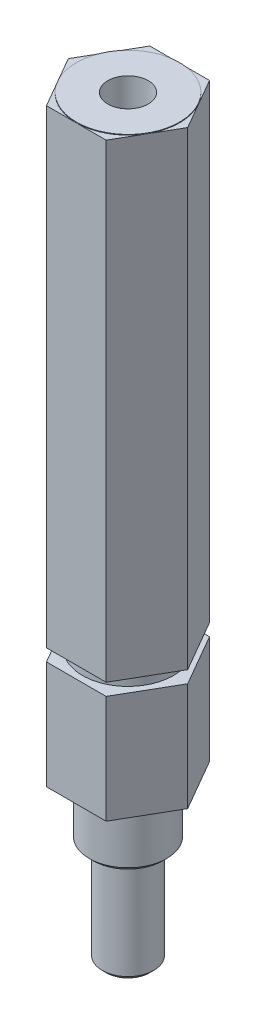
ISO-10303-21;
HEADER;
FILE_DESCRIPTION(('STEP AP214'),'2;1');
FILE_NAME('part.step','',(''),(''),'','','');
FILE_SCHEMA(('AUTOMOTIVE_DESIGN { 1 0 10303 214 1 1 1 1 }'));
ENDSEC;
DATA;
#1=APPLICATION_CONTEXT('core data for automotive mechanical design processes');
#2=APPLICATION_PROTOCOL_DEFINITION('international standard','automotive_design',2000,#1);
#3=PRODUCT_CONTEXT('',#1,'mechanical');
#4=PRODUCT('Part','Part','',(#3));
#5=PRODUCT_RELATED_PRODUCT_CATEGORY('part','',(#4));
#6=PRODUCT_DEFINITION_FORMATION('','',#4);
#7=PRODUCT_DEFINITION_CONTEXT('part definition',#1,'design');
#8=PRODUCT_DEFINITION('design','',#6,#7);
#9=PRODUCT_DEFINITION_SHAPE('','',#8);
#10=(LENGTH_UNIT() NAMED_UNIT(*) SI_UNIT(.MILLI.,.METRE.));
#11=(NAMED_UNIT(*) PLANE_ANGLE_UNIT() SI_UNIT($,.RADIAN.));
#12=(NAMED_UNIT(*) SI_UNIT($,.STERADIAN.) SOLID_ANGLE_UNIT());
#13=UNCERTAINTY_MEASURE_WITH_UNIT(LENGTH_MEASURE(1.E-05),#10,'distance_accuracy_value','');
#14=(GEOMETRIC_REPRESENTATION_CONTEXT(3) GLOBAL_UNCERTAINTY_ASSIGNED_CONTEXT((#13)) GLOBAL_UNIT_ASSIGNED_CONTEXT((#10,
#11,#12)) REPRESENTATION_CONTEXT('',''));
#15=CARTESIAN_POINT('',(0.,0.,0.));
#16=DIRECTION('',(0.,0.,1.));
#17=DIRECTION('',(1.,0.,0.));
#18=AXIS2_PLACEMENT_3D('',#15,#16,#17);
#19=CARTESIAN_POINT('',(-38.3071337161431,-92.2782,-16.669011646302));
#20=DIRECTION('',(0.,1.,0.));
#21=DIRECTION('',(0.,0.,1.));
#22=AXIS2_PLACEMENT_3D('',#19,#20,#21);
#23=PLANE('',#22);
#24=CARTESIAN_POINT('',(-38.3071337161431,-92.2782000000097,-16.669011646302));
#25=DIRECTION('',(0.,1.,0.));
#26=DIRECTION('',(0.,0.,1.));
#27=AXIS2_PLACEMENT_3D('',#24,#25,#26);
#28=CIRCLE('',#27,2.6542999999766);
#29=CARTESIAN_POINT('',(-38.3071337161431,-92.2782000000097,-14.0147116463254));
#30=VERTEX_POINT('',#29);
#31=EDGE_CURVE('E20',#30,#30,#28,.T.);
#32=ORIENTED_EDGE('',*,*,#31,.F.);
#33=EDGE_LOOP('',(#32));
#34=FACE_BOUND('',#33,.T.);
#35=ADVANCED_FACE('F17',(#34),#23,.F.);
#36=CARTESIAN_POINT('',(-38.3071337161431,-91.7702000000986,-16.669011646302));
#37=DIRECTION('',(0.,1.,0.));
#38=DIRECTION('',(0.,0.,1.));
#39=AXIS2_PLACEMENT_3D('',#36,#37,#38);
#40=CONICAL_SURFACE('',#39,3.16229999988774,0.785398163397448);
#41=CARTESIAN_POINT('',(-38.3071337161431,-91.7702,-16.669011646302));
#42=DIRECTION('',(0.,-1.,0.));
#43=DIRECTION('',(0.,0.,-1.));
#44=AXIS2_PLACEMENT_3D('',#41,#42,#43);
#45=CIRCLE('',#44,3.1623);
#46=CARTESIAN_POINT('',(-38.3071337161431,-91.7702,-19.831311646302));
#47=VERTEX_POINT('',#46);
#48=EDGE_CURVE('E168',#47,#47,#45,.F.);
#49=ORIENTED_EDGE('',*,*,#48,.F.);
#50=EDGE_LOOP('',(#49));
#51=FACE_BOUND('',#50,.T.);
#52=ORIENTED_EDGE('',*,*,#31,.T.);
#53=EDGE_LOOP('',(#52));
#54=FACE_BOUND('',#53,.T.);
#55=ADVANCED_FACE('F217',(#51,#54),#40,.T.);
#56=CARTESIAN_POINT('',(-38.3071337161431,-92.2782,-16.669011646302));
#57=DIRECTION('',(0.,-1.,0.));
#58=DIRECTION('',(0.,0.,-1.));
#59=AXIS2_PLACEMENT_3D('',#56,#57,#58);
#60=CYLINDRICAL_SURFACE('',#59,3.1623);
#61=CARTESIAN_POINT('',(-38.3071337161431,-79.5782,-16.669011646302));
#62=DIRECTION('',(0.,-1.,0.));
#63=DIRECTION('',(0.,0.,-1.));
#64=AXIS2_PLACEMENT_3D('',#61,#62,#63);
#65=CIRCLE('',#64,3.1623);
#66=CARTESIAN_POINT('',(-38.3071337161431,-79.5782,-19.831311646302));
#67=VERTEX_POINT('',#66);
#68=EDGE_CURVE('E171',#67,#67,#65,.T.);
#69=ORIENTED_EDGE('',*,*,#68,.T.);
#70=EDGE_LOOP('',(#69));
#71=FACE_BOUND('',#70,.T.);
#72=ORIENTED_EDGE('',*,*,#48,.T.);
#73=EDGE_LOOP('',(#72));
#74=FACE_BOUND('',#73,.T.);
#75=ADVANCED_FACE('F201',(#71,#74),#60,.T.);
#76=CARTESIAN_POINT('',(-38.3071337161431,-79.5782,-16.669011646302));
#77=DIRECTION('',(0.,1.,0.));
#78=DIRECTION('',(0.,0.,1.));
#79=AXIS2_PLACEMENT_3D('',#76,#77,#78);
#80=PLANE('',#79);
#81=CARTESIAN_POINT('',(-38.3071337161431,-79.5782000000713,-16.669011646302));
#82=DIRECTION('',(0.,1.,0.));
#83=DIRECTION('',(0.,0.,1.));
#84=AXIS2_PLACEMENT_3D('',#81,#82,#83);
#85=CIRCLE('',#84,4.24179999994759);
#86=CARTESIAN_POINT('',(-38.3071337161431,-79.5782000000713,-12.4272116463544));
#87=VERTEX_POINT('',#86);
#88=EDGE_CURVE('E165',#87,#87,#85,.T.);
#89=ORIENTED_EDGE('',*,*,#88,.F.);
#90=EDGE_LOOP('',(#89));
#91=FACE_BOUND('',#90,.T.);
#92=ORIENTED_EDGE('',*,*,#68,.F.);
#93=EDGE_LOOP('',(#92));
#94=FACE_BOUND('',#93,.T.);
#95=ADVANCED_FACE('F204',(#91,#94),#80,.F.);
#96=CARTESIAN_POINT('',(-38.3071337161431,-79.0702000001033,-16.669011646302));
#97=DIRECTION('',(0.,1.,0.));
#98=DIRECTION('',(0.,0.,1.));
#99=AXIS2_PLACEMENT_3D('',#96,#97,#98);
#100=CONICAL_SURFACE('',#99,4.74979999991557,0.785398163397448);
#101=CARTESIAN_POINT('',(-38.3071337161431,-79.0702,-16.669011646302));
#102=DIRECTION('',(0.,-1.,0.));
#103=DIRECTION('',(0.,0.,-1.));
#104=AXIS2_PLACEMENT_3D('',#101,#102,#103);
#105=CIRCLE('',#104,4.7498);
#106=CARTESIAN_POINT('',(-38.3071337161431,-79.0702,-21.418811646302));
#107=VERTEX_POINT('',#106);
#108=EDGE_CURVE('E162',#107,#107,#105,.F.);
#109=ORIENTED_EDGE('',*,*,#108,.F.);
#110=EDGE_LOOP('',(#109));
#111=FACE_BOUND('',#110,.T.);
#112=ORIENTED_EDGE('',*,*,#88,.T.);
#113=EDGE_LOOP('',(#112));
#114=FACE_BOUND('',#113,.T.);
#115=ADVANCED_FACE('F206',(#111,#114),#100,.T.);
#116=CARTESIAN_POINT('',(-38.3071337161431,-79.5782,-16.669011646302));
#117=DIRECTION('',(0.,-1.,0.));
#118=DIRECTION('',(0.,0.,-1.));
#119=AXIS2_PLACEMENT_3D('',#116,#117,#118);
#120=CYLINDRICAL_SURFACE('',#119,4.7498);
#121=CARTESIAN_POINT('',(-38.3071337161431,-72.4662,-16.669011646302));
#122=DIRECTION('',(0.,-1.,0.));
#123=DIRECTION('',(0.,0.,-1.));
#124=AXIS2_PLACEMENT_3D('',#121,#122,#123);
#125=CIRCLE('',#124,4.7498);
#126=CARTESIAN_POINT('',(-38.3071337161431,-72.4662,-21.418811646302));
#127=VERTEX_POINT('',#126);
#128=EDGE_CURVE('E161',#127,#127,#125,.T.);
#129=ORIENTED_EDGE('',*,*,#128,.T.);
#130=EDGE_LOOP('',(#129));
#131=FACE_BOUND('',#130,.T.);
#132=ORIENTED_EDGE('',*,*,#108,.T.);
#133=EDGE_LOOP('',(#132));
#134=FACE_BOUND('',#133,.T.);
#135=ADVANCED_FACE('F214',(#131,#134),#120,.T.);
#136=CARTESIAN_POINT('',(-38.3071337161431,-72.4662,-3.96901164630201));
#137=DIRECTION('',(0.,1.,0.));
#138=DIRECTION('',(0.,0.,1.));
#139=AXIS2_PLACEMENT_3D('',#136,#137,#138);
#140=PLANE('',#139);
#141=DIRECTION('',(-0.5,0.,0.866025403784439));
#142=VECTOR('',#141,1.);
#143=CARTESIAN_POINT('',(-41.9733079254973,-72.4662,-23.019011646302));
#144=LINE('',#143,#142);
#145=CARTESIAN_POINT('',(-41.9733079254973,-72.4662,-23.019011646302));
#146=VERTEX_POINT('',#145);
#147=CARTESIAN_POINT('',(-45.6394821348514,-72.4662,-16.669011646302));
#148=VERTEX_POINT('',#147);
#149=EDGE_CURVE('E105',#146,#148,#144,.T.);
#150=ORIENTED_EDGE('',*,*,#149,.F.);
#151=DIRECTION('',(-1.,0.,0.));
#152=VECTOR('',#151,1.);
#153=CARTESIAN_POINT('',(-34.640959506789,-72.4662,-23.019011646302));
#154=LINE('',#153,#152);
#155=CARTESIAN_POINT('',(-34.640959506789,-72.4662,-23.019011646302));
#156=VERTEX_POINT('',#155);
#157=EDGE_CURVE('E157',#156,#146,#154,.T.);
#158=ORIENTED_EDGE('',*,*,#157,.F.);
#159=DIRECTION('',(-0.5,0.,-0.866025403784439));
#160=VECTOR('',#159,1.);
#161=CARTESIAN_POINT('',(-30.9747852974349,-72.4662,-16.669011646302));
#162=LINE('',#161,#160);
#163=CARTESIAN_POINT('',(-30.9747852974349,-72.4662,-16.669011646302));
#164=VERTEX_POINT('',#163);
#165=EDGE_CURVE('E151',#164,#156,#162,.T.);
#166=ORIENTED_EDGE('',*,*,#165,.F.);
#167=DIRECTION('',(0.500000000000001,0.,-0.866025403784438));
#168=VECTOR('',#167,1.);
#169=CARTESIAN_POINT('',(-34.640959506789,-72.4662,-10.319011646302));
#170=LINE('',#169,#168);
#171=CARTESIAN_POINT('',(-34.640959506789,-72.4662,-10.319011646302));
#172=VERTEX_POINT('',#171);
#173=EDGE_CURVE('E145',#172,#164,#170,.T.);
#174=ORIENTED_EDGE('',*,*,#173,.F.);
#175=DIRECTION('',(1.,0.,0.));
#176=VECTOR('',#175,1.);
#177=CARTESIAN_POINT('',(-41.9733079254973,-72.4662,-10.319011646302));
#178=LINE('',#177,#176);
#179=CARTESIAN_POINT('',(-41.9733079254973,-72.4662,-10.319011646302));
#180=VERTEX_POINT('',#179);
#181=EDGE_CURVE('E139',#180,#172,#178,.T.);
#182=ORIENTED_EDGE('',*,*,#181,.F.);
#183=DIRECTION('',(0.5,0.,0.866025403784439));
#184=VECTOR('',#183,1.);
#185=CARTESIAN_POINT('',(-45.6394821348514,-72.4662,-16.669011646302));
#186=LINE('',#185,#184);
#187=EDGE_CURVE('E125',#148,#180,#186,.T.);
#188=ORIENTED_EDGE('',*,*,#187,.F.);
#189=EDGE_LOOP('',(#150,#158,#166,#174,#182,#188));
#190=FACE_BOUND('',#189,.T.);
#191=ORIENTED_EDGE('',*,*,#128,.F.);
#192=EDGE_LOOP('',(#191));
#193=FACE_BOUND('',#192,.T.);
#194=ADVANCED_FACE('F113',(#190,#193),#140,.F.);
#195=CARTESIAN_POINT('',(-38.3071337161431,-15.7988000000842,-16.669011646302));
#196=DIRECTION('',(0.,1.,0.));
#197=DIRECTION('',(0.,0.,1.));
#198=AXIS2_PLACEMENT_3D('',#195,#196,#197);
#199=CONICAL_SURFACE('',#198,2.48792999984279,1.02974425854432);
#200=CARTESIAN_POINT('',(-38.3071337161431,-17.2936991599499,-16.6690116461723));
#201=VERTEX_POINT('',#200);
#202=VERTEX_LOOP('',#201);
#203=FACE_BOUND('',#202,.T.);
#204=CARTESIAN_POINT('',(-38.3071337161431,-15.7988,-16.669011646302));
#205=DIRECTION('',(0.,1.,0.));
#206=DIRECTION('',(0.,0.,1.));
#207=AXIS2_PLACEMENT_3D('',#204,#205,#206);
#208=CIRCLE('',#207,2.48793);
#209=CARTESIAN_POINT('',(-38.3071337161431,-15.7988,-14.181081646302));
#210=VERTEX_POINT('',#209);
#211=EDGE_CURVE('E117',#210,#210,#208,.T.);
#212=ORIENTED_EDGE('',*,*,#211,.T.);
#213=EDGE_LOOP('',(#212));
#214=FACE_BOUND('',#213,.T.);
#215=ADVANCED_FACE('F109',(#203,#214),#199,.F.);
#216=CARTESIAN_POINT('',(-41.9733079254973,-72.4662,-23.019011646302));
#217=DIRECTION('',(-0.866025403784439,0.,-0.5));
#218=DIRECTION('',(-0.5,0.,0.866025403784439));
#219=AXIS2_PLACEMENT_3D('',#216,#217,#218);
#220=PLANE('',#219);
#221=ORIENTED_EDGE('',*,*,#149,.T.);
#222=DIRECTION('',(0.,1.,0.));
#223=VECTOR('',#222,1.);
#224=CARTESIAN_POINT('',(-45.6394821348514,-72.4662,-16.669011646302));
#225=LINE('',#224,#223);
#226=CARTESIAN_POINT('',(-45.6394821348514,-59.182,-16.669011646302));
#227=VERTEX_POINT('',#226);
#228=EDGE_CURVE('E133',#227,#148,#225,.F.);
#229=ORIENTED_EDGE('',*,*,#228,.F.);
#230=DIRECTION('',(0.499999999999997,0.,-0.86602540378444));
#231=VECTOR('',#230,1.);
#232=CARTESIAN_POINT('',(-45.6394821348514,-59.182,-16.669011646302));
#233=LINE('',#232,#231);
#234=CARTESIAN_POINT('',(-41.9733079254973,-59.182,-23.019011646302));
#235=VERTEX_POINT('',#234);
#236=EDGE_CURVE('E119',#227,#235,#233,.T.);
#237=ORIENTED_EDGE('',*,*,#236,.T.);
#238=DIRECTION('',(0.,1.,0.));
#239=VECTOR('',#238,1.);
#240=CARTESIAN_POINT('',(-41.9733079254973,-72.4662,-23.019011646302));
#241=LINE('',#240,#239);
#242=EDGE_CURVE('E154',#146,#235,#241,.T.);
#243=ORIENTED_EDGE('',*,*,#242,.F.);
#244=EDGE_LOOP('',(#221,#229,#237,#243));
#245=FACE_BOUND('',#244,.T.);
#246=ADVANCED_FACE('F112',(#245),#220,.T.);
#247=CARTESIAN_POINT('',(-34.640959506789,-72.4662,-23.019011646302));
#248=DIRECTION('',(0.,0.,-1.));
#249=DIRECTION('',(-1.,0.,0.));
#250=AXIS2_PLACEMENT_3D('',#247,#248,#249);
#251=PLANE('',#250);
#252=ORIENTED_EDGE('',*,*,#157,.T.);
#253=ORIENTED_EDGE('',*,*,#242,.T.);
#254=DIRECTION('',(1.,0.,0.));
#255=VECTOR('',#254,1.);
#256=CARTESIAN_POINT('',(-21.7881364409388,-59.182,-23.019011646302));
#257=LINE('',#256,#255);
#258=CARTESIAN_POINT('',(-34.640959506789,-59.182,-23.019011646302));
#259=VERTEX_POINT('',#258);
#260=EDGE_CURVE('E122',#235,#259,#257,.T.);
#261=ORIENTED_EDGE('',*,*,#260,.T.);
#262=DIRECTION('',(0.,1.,0.));
#263=VECTOR('',#262,1.);
#264=CARTESIAN_POINT('',(-34.640959506789,-72.4662,-23.019011646302));
#265=LINE('',#264,#263);
#266=EDGE_CURVE('E148',#156,#259,#265,.T.);
#267=ORIENTED_EDGE('',*,*,#266,.F.);
#268=EDGE_LOOP('',(#252,#253,#261,#267));
#269=FACE_BOUND('',#268,.T.);
#270=ADVANCED_FACE('F290',(#269),#251,.T.);
#271=CARTESIAN_POINT('',(-30.9747852974349,-72.4662,-16.669011646302));
#272=DIRECTION('',(0.866025403784439,0.,-0.5));
#273=DIRECTION('',(-0.5,0.,-0.866025403784439));
#274=AXIS2_PLACEMENT_3D('',#271,#272,#273);
#275=PLANE('',#274);
#276=ORIENTED_EDGE('',*,*,#165,.T.);
#277=ORIENTED_EDGE('',*,*,#266,.T.);
#278=DIRECTION('',(0.499999999999998,0.,0.86602540378444));
#279=VECTOR('',#278,1.);
#280=CARTESIAN_POINT('',(-34.640959506789,-59.182,-23.019011646302));
#281=LINE('',#280,#279);
#282=CARTESIAN_POINT('',(-30.9747852974349,-59.182,-16.669011646302));
#283=VERTEX_POINT('',#282);
#284=EDGE_CURVE('E493',#259,#283,#281,.T.);
#285=ORIENTED_EDGE('',*,*,#284,.T.);
#286=DIRECTION('',(0.,1.,0.));
#287=VECTOR('',#286,1.);
#288=CARTESIAN_POINT('',(-30.9747852974349,-72.4662,-16.669011646302));
#289=LINE('',#288,#287);
#290=EDGE_CURVE('E142',#164,#283,#289,.T.);
#291=ORIENTED_EDGE('',*,*,#290,.F.);
#292=EDGE_LOOP('',(#276,#277,#285,#291));
#293=FACE_BOUND('',#292,.T.);
#294=ADVANCED_FACE('F286',(#293),#275,.T.);
#295=CARTESIAN_POINT('',(-34.640959506789,-72.4662,-10.319011646302));
#296=DIRECTION('',(0.866025403784438,0.,0.500000000000001));
#297=DIRECTION('',(0.500000000000001,0.,-0.866025403784438));
#298=AXIS2_PLACEMENT_3D('',#295,#296,#297);
#299=PLANE('',#298);
#300=ORIENTED_EDGE('',*,*,#173,.T.);
#301=ORIENTED_EDGE('',*,*,#290,.T.);
#302=DIRECTION('',(-0.499999999999998,0.,0.86602540378444));
#303=VECTOR('',#302,1.);
#304=CARTESIAN_POINT('',(-30.9747852974349,-59.182,-16.669011646302));
#305=LINE('',#304,#303);
#306=CARTESIAN_POINT('',(-34.640959506789,-59.182,-10.319011646302));
#307=VERTEX_POINT('',#306);
#308=EDGE_CURVE('E495',#283,#307,#305,.T.);
#309=ORIENTED_EDGE('',*,*,#308,.T.);
#310=DIRECTION('',(0.,1.,0.));
#311=VECTOR('',#310,1.);
#312=CARTESIAN_POINT('',(-34.640959506789,-72.4662,-10.319011646302));
#313=LINE('',#312,#311);
#314=EDGE_CURVE('E136',#172,#307,#313,.T.);
#315=ORIENTED_EDGE('',*,*,#314,.F.);
#316=EDGE_LOOP('',(#300,#301,#309,#315));
#317=FACE_BOUND('',#316,.T.);
#318=ADVANCED_FACE('F282',(#317),#299,.T.);
#319=CARTESIAN_POINT('',(-41.9733079254973,-72.4662,-10.319011646302));
#320=DIRECTION('',(0.,0.,1.));
#321=DIRECTION('',(1.,0.,0.));
#322=AXIS2_PLACEMENT_3D('',#319,#320,#321);
#323=PLANE('',#322);
#324=ORIENTED_EDGE('',*,*,#181,.T.);
#325=ORIENTED_EDGE('',*,*,#314,.T.);
#326=DIRECTION('',(1.,0.,0.));
#327=VECTOR('',#326,1.);
#328=CARTESIAN_POINT('',(-21.7881364409388,-59.182,-10.319011646302));
#329=LINE('',#328,#327);
#330=CARTESIAN_POINT('',(-41.9733079254973,-59.182,-10.319011646302));
#331=VERTEX_POINT('',#330);
#332=EDGE_CURVE('E485',#307,#331,#329,.F.);
#333=ORIENTED_EDGE('',*,*,#332,.T.);
#334=DIRECTION('',(0.,1.,0.));
#335=VECTOR('',#334,1.);
#336=CARTESIAN_POINT('',(-41.9733079254973,-72.4662,-10.319011646302));
#337=LINE('',#336,#335);
#338=EDGE_CURVE('E120',#180,#331,#337,.T.);
#339=ORIENTED_EDGE('',*,*,#338,.F.);
#340=EDGE_LOOP('',(#324,#325,#333,#339));
#341=FACE_BOUND('',#340,.T.);
#342=ADVANCED_FACE('F278',(#341),#323,.T.);
#343=CARTESIAN_POINT('',(-45.6394821348514,-72.4662,-16.669011646302));
#344=DIRECTION('',(-0.866025403784439,0.,0.5));
#345=DIRECTION('',(0.5,0.,0.866025403784439));
#346=AXIS2_PLACEMENT_3D('',#343,#344,#345);
#347=PLANE('',#346);
#348=ORIENTED_EDGE('',*,*,#187,.T.);
#349=ORIENTED_EDGE('',*,*,#338,.T.);
#350=DIRECTION('',(-0.499999999999997,0.,-0.86602540378444));
#351=VECTOR('',#350,1.);
#352=CARTESIAN_POINT('',(-41.9733079254973,-59.182,-10.319011646302));
#353=LINE('',#352,#351);
#354=EDGE_CURVE('E194',#331,#227,#353,.T.);
#355=ORIENTED_EDGE('',*,*,#354,.T.);
#356=ORIENTED_EDGE('',*,*,#228,.T.);
#357=EDGE_LOOP('',(#348,#349,#355,#356));
#358=FACE_BOUND('',#357,.T.);
#359=ADVANCED_FACE('F274',(#358),#347,.T.);
#360=CARTESIAN_POINT('',(-38.3071337161431,0.0761999999999985,-16.669011646302));
#361=DIRECTION('',(0.,1.,0.));
#362=DIRECTION('',(0.,0.,1.));
#363=AXIS2_PLACEMENT_3D('',#360,#361,#362);
#364=CYLINDRICAL_SURFACE('',#363,2.48793);
#365=CARTESIAN_POINT('',(-38.3071337161431,0.0761999999999985,-16.669011646302));
#366=DIRECTION('',(0.,1.,0.));
#367=DIRECTION('',(0.,0.,1.));
#368=AXIS2_PLACEMENT_3D('',#365,#366,#367);
#369=CIRCLE('',#368,2.48793);
#370=CARTESIAN_POINT('',(-38.3071337161431,0.0761999999999985,-14.181081646302));
#371=VERTEX_POINT('',#370);
#372=EDGE_CURVE('E191',#371,#371,#369,.T.);
#373=ORIENTED_EDGE('',*,*,#372,.T.);
#374=EDGE_LOOP('',(#373));
#375=FACE_BOUND('',#374,.T.);
#376=ORIENTED_EDGE('',*,*,#211,.F.);
#377=EDGE_LOOP('',(#376));
#378=FACE_BOUND('',#377,.T.);
#379=ADVANCED_FACE('F270',(#375,#378),#364,.F.);
#380=CARTESIAN_POINT('',(-21.7881364409388,-59.182,-16.669011646302));
#381=DIRECTION('',(0.,-1.,0.));
#382=DIRECTION('',(0.,0.,-1.));
#383=AXIS2_PLACEMENT_3D('',#380,#381,#382);
#384=PLANE('',#383);
#385=ORIENTED_EDGE('',*,*,#332,.F.);
#386=ORIENTED_EDGE('',*,*,#308,.F.);
#387=ORIENTED_EDGE('',*,*,#284,.F.);
#388=ORIENTED_EDGE('',*,*,#260,.F.);
#389=ORIENTED_EDGE('',*,*,#236,.F.);
#390=ORIENTED_EDGE('',*,*,#354,.F.);
#391=EDGE_LOOP('',(#385,#386,#387,#388,#389,#390));
#392=FACE_BOUND('',#391,.T.);
#393=CARTESIAN_POINT('',(-38.3071337161431,-59.182,-16.669011646302));
#394=DIRECTION('',(0.,-1.,0.));
#395=DIRECTION('',(0.,0.,-1.));
#396=AXIS2_PLACEMENT_3D('',#393,#394,#395);
#397=CIRCLE('',#396,5.58800000000002);
#398=CARTESIAN_POINT('',(-38.3071337161431,-59.182,-22.257011646302));
#399=VERTEX_POINT('',#398);
#400=EDGE_CURVE('E188',#399,#399,#397,.F.);
#401=ORIENTED_EDGE('',*,*,#400,.F.);
#402=EDGE_LOOP('',(#401));
#403=FACE_BOUND('',#402,.T.);
#404=ADVANCED_FACE('F266',(#392,#403),#384,.F.);
#405=CARTESIAN_POINT('',(-38.3071337161431,0.0762,-16.669011646302));
#406=DIRECTION('',(0.,-1.,0.));
#407=DIRECTION('',(0.,0.,-1.));
#408=AXIS2_PLACEMENT_3D('',#405,#406,#407);
#409=PLANE('',#408);
#410=CARTESIAN_POINT('',(-38.3071337161431,0.0762,-16.669011646302));
#411=DIRECTION('',(0.,1.,0.));
#412=DIRECTION('',(0.,0.,1.));
#413=AXIS2_PLACEMENT_3D('',#410,#411,#412);
#414=CIRCLE('',#413,6.3373);
#415=CARTESIAN_POINT('',(-38.3071337161431,0.0762,-10.331711646302));
#416=VERTEX_POINT('',#415);
#417=EDGE_CURVE('E184',#416,#416,#414,.F.);
#418=ORIENTED_EDGE('',*,*,#417,.F.);
#419=EDGE_LOOP('',(#418));
#420=FACE_BOUND('',#419,.T.);
#421=ORIENTED_EDGE('',*,*,#372,.F.);
#422=EDGE_LOOP('',(#421));
#423=FACE_BOUND('',#422,.T.);
#424=ADVANCED_FACE('F262',(#420,#423),#409,.F.);
#425=CARTESIAN_POINT('',(-38.3071337161431,-25.4,-16.669011646302));
#426=DIRECTION('',(0.,-1.,0.));
#427=DIRECTION('',(0.,0.,-1.));
#428=AXIS2_PLACEMENT_3D('',#425,#426,#427);
#429=CYLINDRICAL_SURFACE('',#428,5.58800000000002);
#430=ORIENTED_EDGE('',*,*,#400,.T.);
#431=EDGE_LOOP('',(#430));
#432=FACE_BOUND('',#431,.T.);
#433=CARTESIAN_POINT('',(-38.3071337161431,-57.6834,-16.669011646302));
#434=DIRECTION('',(0.,-1.,0.));
#435=DIRECTION('',(0.,0.,-1.));
#436=AXIS2_PLACEMENT_3D('',#433,#434,#435);
#437=CIRCLE('',#436,5.58800000000002);
#438=CARTESIAN_POINT('',(-38.3071337161431,-57.6834,-22.257011646302));
#439=VERTEX_POINT('',#438);
#440=EDGE_CURVE('E179',#439,#439,#437,.T.);
#441=ORIENTED_EDGE('',*,*,#440,.T.);
#442=EDGE_LOOP('',(#441));
#443=FACE_BOUND('',#442,.T.);
#444=ADVANCED_FACE('F258',(#432,#443),#429,.T.);
#445=CARTESIAN_POINT('',(-38.3071337161431,0.0762,-16.669011646302));
#446=DIRECTION('',(0.,1.,0.));
#447=DIRECTION('',(0.,0.,1.));
#448=AXIS2_PLACEMENT_3D('',#445,#446,#447);
#449=CYLINDRICAL_SURFACE('',#448,6.3373);
#450=CARTESIAN_POINT('',(-38.3071337161431,0.,-16.669011646302));
#451=DIRECTION('',(0.,1.,0.));
#452=DIRECTION('',(0.,0.,1.));
#453=AXIS2_PLACEMENT_3D('',#450,#451,#452);
#454=CIRCLE('',#453,6.3373);
#455=CARTESIAN_POINT('',(-38.3071337161431,0.,-10.331711646302));
#456=VERTEX_POINT('',#455);
#457=EDGE_CURVE('E174',#456,#456,#454,.F.);
#458=ORIENTED_EDGE('',*,*,#457,.F.);
#459=EDGE_LOOP('',(#458));
#460=FACE_BOUND('',#459,.T.);
#461=ORIENTED_EDGE('',*,*,#417,.T.);
#462=EDGE_LOOP('',(#461));
#463=FACE_BOUND('',#462,.T.);
#464=ADVANCED_FACE('F254',(#460,#463),#449,.T.);
#465=CARTESIAN_POINT('',(-45.6394821348514,-72.4662,-16.669011646302));
#466=DIRECTION('',(-0.866025403784439,0.,0.5));
#467=DIRECTION('',(0.5,0.,0.866025403784439));
#468=AXIS2_PLACEMENT_3D('',#465,#466,#467);
#469=PLANE('',#468);
#470=DIRECTION('',(0.499999999999997,0.,0.86602540378444));
#471=VECTOR('',#470,1.);
#472=CARTESIAN_POINT('',(-45.6394821348514,0.,-16.669011646302));
#473=LINE('',#472,#471);
#474=CARTESIAN_POINT('',(-45.6394821348514,0.,-16.669011646302));
#475=VERTEX_POINT('',#474);
#476=CARTESIAN_POINT('',(-41.9733079254973,0.,-10.319011646302));
#477=VERTEX_POINT('',#476);
#478=EDGE_CURVE('E177',#475,#477,#473,.T.);
#479=ORIENTED_EDGE('',*,*,#478,.F.);
#480=DIRECTION('',(0.,1.,0.));
#481=VECTOR('',#480,1.);
#482=CARTESIAN_POINT('',(-45.6394821348514,-72.4662,-16.669011646302));
#483=LINE('',#482,#481);
#484=CARTESIAN_POINT('',(-45.6394821348514,-57.6834,-16.669011646302));
#485=VERTEX_POINT('',#484);
#486=EDGE_CURVE('E178',#485,#475,#483,.T.);
#487=ORIENTED_EDGE('',*,*,#486,.F.);
#488=DIRECTION('',(0.499999999999997,0.,0.86602540378444));
#489=VECTOR('',#488,1.);
#490=CARTESIAN_POINT('',(-45.6394821348514,-57.6834,-16.669011646302));
#491=LINE('',#490,#489);
#492=CARTESIAN_POINT('',(-41.9733079254973,-57.6834,-10.319011646302));
#493=VERTEX_POINT('',#492);
#494=EDGE_CURVE('E505',#485,#493,#491,.T.);
#495=ORIENTED_EDGE('',*,*,#494,.T.);
#496=DIRECTION('',(0.,1.,0.));
#497=VECTOR('',#496,1.);
#498=CARTESIAN_POINT('',(-41.9733079254973,-72.4662,-10.319011646302));
#499=LINE('',#498,#497);
#500=EDGE_CURVE('E187',#477,#493,#499,.F.);
#501=ORIENTED_EDGE('',*,*,#500,.F.);
#502=EDGE_LOOP('',(#479,#487,#495,#501));
#503=FACE_BOUND('',#502,.T.);
#504=ADVANCED_FACE('F250',(#503),#469,.T.);
#505=CARTESIAN_POINT('',(-41.9733079254973,-72.4662,-10.319011646302));
#506=DIRECTION('',(0.,0.,1.));
#507=DIRECTION('',(1.,0.,0.));
#508=AXIS2_PLACEMENT_3D('',#505,#506,#507);
#509=PLANE('',#508);
#510=DIRECTION('',(1.,0.,0.));
#511=VECTOR('',#510,1.);
#512=CARTESIAN_POINT('',(-38.3071337161431,0.,-10.319011646302));
#513=LINE('',#512,#511);
#514=CARTESIAN_POINT('',(-34.640959506789,0.,-10.319011646302));
#515=VERTEX_POINT('',#514);
#516=EDGE_CURVE('E516',#477,#515,#513,.T.);
#517=ORIENTED_EDGE('',*,*,#516,.F.);
#518=ORIENTED_EDGE('',*,*,#500,.T.);
#519=DIRECTION('',(1.,0.,0.));
#520=VECTOR('',#519,1.);
#521=CARTESIAN_POINT('',(-32.7191337161431,-57.6834,-10.319011646302));
#522=LINE('',#521,#520);
#523=CARTESIAN_POINT('',(-34.640959506789,-57.6834,-10.319011646302));
#524=VERTEX_POINT('',#523);
#525=EDGE_CURVE('E507',#493,#524,#522,.T.);
#526=ORIENTED_EDGE('',*,*,#525,.T.);
#527=DIRECTION('',(0.,1.,0.));
#528=VECTOR('',#527,1.);
#529=CARTESIAN_POINT('',(-34.640959506789,-72.4662,-10.319011646302));
#530=LINE('',#529,#528);
#531=EDGE_CURVE('E502',#515,#524,#530,.F.);
#532=ORIENTED_EDGE('',*,*,#531,.F.);
#533=EDGE_LOOP('',(#517,#518,#526,#532));
#534=FACE_BOUND('',#533,.T.);
#535=ADVANCED_FACE('F246',(#534),#509,.T.);
#536=CARTESIAN_POINT('',(-34.640959506789,-72.4662,-10.319011646302));
#537=DIRECTION('',(0.866025403784438,0.,0.500000000000001));
#538=DIRECTION('',(0.500000000000001,0.,-0.866025403784438));
#539=AXIS2_PLACEMENT_3D('',#536,#537,#538);
#540=PLANE('',#539);
#541=DIRECTION('',(0.499999999999998,0.,-0.86602540378444));
#542=VECTOR('',#541,1.);
#543=CARTESIAN_POINT('',(-34.640959506789,0.,-10.319011646302));
#544=LINE('',#543,#542);
#545=CARTESIAN_POINT('',(-30.9747852974349,0.,-16.669011646302));
#546=VERTEX_POINT('',#545);
#547=EDGE_CURVE('E519',#515,#546,#544,.T.);
#548=ORIENTED_EDGE('',*,*,#547,.F.);
#549=ORIENTED_EDGE('',*,*,#531,.T.);
#550=DIRECTION('',(0.499999999999998,0.,-0.86602540378444));
#551=VECTOR('',#550,1.);
#552=CARTESIAN_POINT('',(-34.640959506789,-57.6834,-10.319011646302));
#553=LINE('',#552,#551);
#554=CARTESIAN_POINT('',(-30.9747852974349,-57.6834,-16.669011646302));
#555=VERTEX_POINT('',#554);
#556=EDGE_CURVE('E183',#524,#555,#553,.T.);
#557=ORIENTED_EDGE('',*,*,#556,.T.);
#558=DIRECTION('',(0.,1.,0.));
#559=VECTOR('',#558,1.);
#560=CARTESIAN_POINT('',(-30.9747852974349,-72.4662,-16.669011646302));
#561=LINE('',#560,#559);
#562=EDGE_CURVE('E528',#546,#555,#561,.F.);
#563=ORIENTED_EDGE('',*,*,#562,.F.);
#564=EDGE_LOOP('',(#548,#549,#557,#563));
#565=FACE_BOUND('',#564,.T.);
#566=ADVANCED_FACE('F242',(#565),#540,.T.);
#567=CARTESIAN_POINT('',(-32.7191337161431,-57.6834,-16.669011646302));
#568=DIRECTION('',(0.,1.,0.));
#569=DIRECTION('',(0.,0.,1.));
#570=AXIS2_PLACEMENT_3D('',#567,#568,#569);
#571=PLANE('',#570);
#572=ORIENTED_EDGE('',*,*,#440,.F.);
#573=EDGE_LOOP('',(#572));
#574=FACE_BOUND('',#573,.T.);
#575=ORIENTED_EDGE('',*,*,#556,.F.);
#576=ORIENTED_EDGE('',*,*,#525,.F.);
#577=ORIENTED_EDGE('',*,*,#494,.F.);
#578=DIRECTION('',(-0.5,0.,0.866025403784439));
#579=VECTOR('',#578,1.);
#580=CARTESIAN_POINT('',(-41.9733079254973,-57.6834,-23.019011646302));
#581=LINE('',#580,#579);
#582=CARTESIAN_POINT('',(-41.9733079254973,-57.6834,-23.019011646302));
#583=VERTEX_POINT('',#582);
#584=EDGE_CURVE('E182',#583,#485,#581,.T.);
#585=ORIENTED_EDGE('',*,*,#584,.F.);
#586=DIRECTION('',(-1.,0.,0.));
#587=VECTOR('',#586,1.);
#588=CARTESIAN_POINT('',(-34.640959506789,-57.6834,-23.019011646302));
#589=LINE('',#588,#587);
#590=CARTESIAN_POINT('',(-34.640959506789,-57.6834,-23.019011646302));
#591=VERTEX_POINT('',#590);
#592=EDGE_CURVE('E531',#591,#583,#589,.T.);
#593=ORIENTED_EDGE('',*,*,#592,.F.);
#594=DIRECTION('',(-0.5,0.,-0.866025403784439));
#595=VECTOR('',#594,1.);
#596=CARTESIAN_POINT('',(-30.9747852974349,-57.6834,-16.669011646302));
#597=LINE('',#596,#595);
#598=EDGE_CURVE('E524',#555,#591,#597,.T.);
#599=ORIENTED_EDGE('',*,*,#598,.F.);
#600=EDGE_LOOP('',(#575,#576,#577,#585,#593,#599));
#601=FACE_BOUND('',#600,.T.);
#602=ADVANCED_FACE('F238',(#574,#601),#571,.F.);
#603=CARTESIAN_POINT('',(-41.9733079254973,-72.4662,-23.019011646302));
#604=DIRECTION('',(-0.866025403784439,0.,-0.5));
#605=DIRECTION('',(-0.5,0.,0.866025403784439));
#606=AXIS2_PLACEMENT_3D('',#603,#604,#605);
#607=PLANE('',#606);
#608=DIRECTION('',(-0.499999999999997,0.,0.86602540378444));
#609=VECTOR('',#608,1.);
#610=CARTESIAN_POINT('',(-41.9733079254973,0.,-23.019011646302));
#611=LINE('',#610,#609);
#612=CARTESIAN_POINT('',(-41.9733079254973,0.,-23.019011646302));
#613=VERTEX_POINT('',#612);
#614=EDGE_CURVE('E521',#613,#475,#611,.T.);
#615=ORIENTED_EDGE('',*,*,#614,.F.);
#616=DIRECTION('',(0.,1.,0.));
#617=VECTOR('',#616,1.);
#618=CARTESIAN_POINT('',(-41.9733079254973,-72.4662,-23.019011646302));
#619=LINE('',#618,#617);
#620=EDGE_CURVE('E534',#583,#613,#619,.T.);
#621=ORIENTED_EDGE('',*,*,#620,.F.);
#622=ORIENTED_EDGE('',*,*,#584,.T.);
#623=ORIENTED_EDGE('',*,*,#486,.T.);
#624=EDGE_LOOP('',(#615,#621,#622,#623));
#625=FACE_BOUND('',#624,.T.);
#626=ADVANCED_FACE('F235',(#625),#607,.T.);
#627=CARTESIAN_POINT('',(-38.3071337161431,0.,-3.96901164630201));
#628=DIRECTION('',(0.,1.,0.));
#629=DIRECTION('',(0.,0.,1.));
#630=AXIS2_PLACEMENT_3D('',#627,#628,#629);
#631=PLANE('',#630);
#632=DIRECTION('',(-1.,0.,0.));
#633=VECTOR('',#632,1.);
#634=CARTESIAN_POINT('',(-34.640959506789,0.,-23.019011646302));
#635=LINE('',#634,#633);
#636=CARTESIAN_POINT('',(-34.640959506789,0.,-23.019011646302));
#637=VERTEX_POINT('',#636);
#638=EDGE_CURVE('E26',#613,#637,#635,.F.);
#639=ORIENTED_EDGE('',*,*,#638,.F.);
#640=ORIENTED_EDGE('',*,*,#614,.T.);
#641=ORIENTED_EDGE('',*,*,#478,.T.);
#642=ORIENTED_EDGE('',*,*,#516,.T.);
#643=ORIENTED_EDGE('',*,*,#547,.T.);
#644=DIRECTION('',(-0.5,0.,-0.866025403784439));
#645=VECTOR('',#644,1.);
#646=CARTESIAN_POINT('',(-30.9747852974349,0.,-16.669011646302));
#647=LINE('',#646,#645);
#648=EDGE_CURVE('E35',#637,#546,#647,.F.);
#649=ORIENTED_EDGE('',*,*,#648,.F.);
#650=EDGE_LOOP('',(#639,#640,#641,#642,#643,#649));
#651=FACE_BOUND('',#650,.T.);
#652=ORIENTED_EDGE('',*,*,#457,.T.);
#653=EDGE_LOOP('',(#652));
#654=FACE_BOUND('',#653,.T.);
#655=ADVANCED_FACE('F228',(#651,#654),#631,.T.);
#656=CARTESIAN_POINT('',(-30.9747852974349,-72.4662,-16.669011646302));
#657=DIRECTION('',(0.866025403784439,0.,-0.5));
#658=DIRECTION('',(-0.5,0.,-0.866025403784439));
#659=AXIS2_PLACEMENT_3D('',#656,#657,#658);
#660=PLANE('',#659);
#661=ORIENTED_EDGE('',*,*,#648,.T.);
#662=ORIENTED_EDGE('',*,*,#562,.T.);
#663=ORIENTED_EDGE('',*,*,#598,.T.);
#664=DIRECTION('',(0.,1.,0.));
#665=VECTOR('',#664,1.);
#666=CARTESIAN_POINT('',(-34.640959506789,-72.4662,-23.019011646302));
#667=LINE('',#666,#665);
#668=EDGE_CURVE('E11',#637,#591,#667,.F.);
#669=ORIENTED_EDGE('',*,*,#668,.F.);
#670=EDGE_LOOP('',(#661,#662,#663,#669));
#671=FACE_BOUND('',#670,.T.);
#672=ADVANCED_FACE('F222',(#671),#660,.T.);
#673=CARTESIAN_POINT('',(-34.640959506789,-72.4662,-23.019011646302));
#674=DIRECTION('',(0.,0.,-1.));
#675=DIRECTION('',(-1.,0.,0.));
#676=AXIS2_PLACEMENT_3D('',#673,#674,#675);
#677=PLANE('',#676);
#678=ORIENTED_EDGE('',*,*,#638,.T.);
#679=ORIENTED_EDGE('',*,*,#668,.T.);
#680=ORIENTED_EDGE('',*,*,#592,.T.);
#681=ORIENTED_EDGE('',*,*,#620,.T.);
#682=EDGE_LOOP('',(#678,#679,#680,#681));
#683=FACE_BOUND('',#682,.T.);
#684=ADVANCED_FACE('F220',(#683),#677,.T.);
#685=CLOSED_SHELL('',(#35,#55,#75,#95,#115,#135,#194,#215,#246,#270,#294,#318,#342,#359,#379,
#404,#424,#444,#464,#504,#535,#566,#602,#626,#655,#672,#684));
#686=MANIFOLD_SOLID_BREP('B1',#685);
#687=ADVANCED_BREP_SHAPE_REPRESENTATION('',(#18,#686),#14);
#688=SHAPE_DEFINITION_REPRESENTATION(#9,#687);
ENDSEC;
END-ISO-10303-21;
